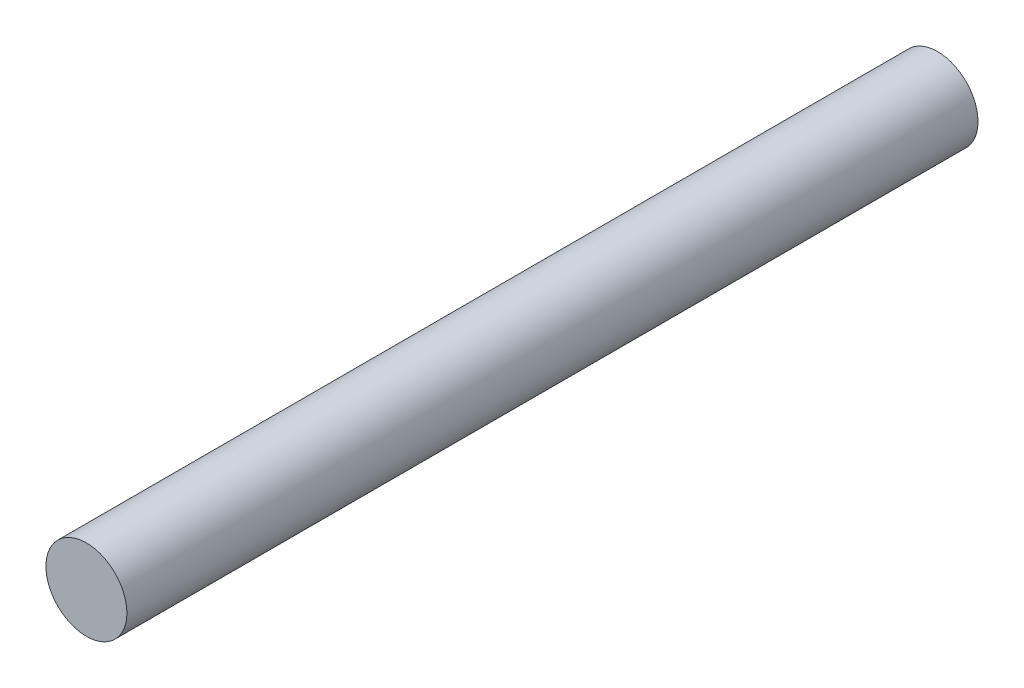
ISO-10303-21;
HEADER;
FILE_DESCRIPTION(('STEP AP214'),'2;1');
FILE_NAME('part.step','',(''),(''),'','','');
FILE_SCHEMA(('AUTOMOTIVE_DESIGN { 1 0 10303 214 1 1 1 1 }'));
ENDSEC;
DATA;
#1=APPLICATION_CONTEXT('core data for automotive mechanical design processes');
#2=APPLICATION_PROTOCOL_DEFINITION('international standard','automotive_design',2000,#1);
#3=PRODUCT_CONTEXT('',#1,'mechanical');
#4=PRODUCT('Part','Part','',(#3));
#5=PRODUCT_RELATED_PRODUCT_CATEGORY('part','',(#4));
#6=PRODUCT_DEFINITION_FORMATION('','',#4);
#7=PRODUCT_DEFINITION_CONTEXT('part definition',#1,'design');
#8=PRODUCT_DEFINITION('design','',#6,#7);
#9=PRODUCT_DEFINITION_SHAPE('','',#8);
#10=(LENGTH_UNIT() NAMED_UNIT(*) SI_UNIT(.MILLI.,.METRE.));
#11=(NAMED_UNIT(*) PLANE_ANGLE_UNIT() SI_UNIT($,.RADIAN.));
#12=(NAMED_UNIT(*) SI_UNIT($,.STERADIAN.) SOLID_ANGLE_UNIT());
#13=UNCERTAINTY_MEASURE_WITH_UNIT(LENGTH_MEASURE(1.E-05),#10,'distance_accuracy_value','');
#14=(GEOMETRIC_REPRESENTATION_CONTEXT(3) GLOBAL_UNCERTAINTY_ASSIGNED_CONTEXT((#13)) GLOBAL_UNIT_ASSIGNED_CONTEXT((#10,
#11,#12)) REPRESENTATION_CONTEXT('',''));
#15=CARTESIAN_POINT('',(0.,0.,0.));
#16=DIRECTION('',(0.,0.,1.));
#17=DIRECTION('',(1.,0.,0.));
#18=AXIS2_PLACEMENT_3D('',#15,#16,#17);
#19=CARTESIAN_POINT('',(0.,0.,20.));
#20=DIRECTION('',(0.,0.,-1.));
#21=DIRECTION('',(-1.,0.,0.));
#22=AXIS2_PLACEMENT_3D('',#19,#20,#21);
#23=CYLINDRICAL_SURFACE('',#22,1.90291704);
#24=CARTESIAN_POINT('',(0.,0.,20.));
#25=DIRECTION('',(0.,0.,1.));
#26=DIRECTION('',(1.,0.,0.));
#27=AXIS2_PLACEMENT_3D('',#24,#25,#26);
#28=CIRCLE('',#27,1.90291704);
#29=CARTESIAN_POINT('',(1.90291704,0.,20.));
#30=VERTEX_POINT('',#29);
#31=EDGE_CURVE('E10',#30,#30,#28,.T.);
#32=ORIENTED_EDGE('',*,*,#31,.F.);
#33=EDGE_LOOP('',(#32));
#34=FACE_BOUND('',#33,.T.);
#35=CARTESIAN_POINT('',(0.,0.,-20.));
#36=DIRECTION('',(0.,0.,1.));
#37=DIRECTION('',(1.,0.,0.));
#38=AXIS2_PLACEMENT_3D('',#35,#36,#37);
#39=CIRCLE('',#38,1.90291704);
#40=CARTESIAN_POINT('',(1.90291704,0.,-20.));
#41=VERTEX_POINT('',#40);
#42=EDGE_CURVE('E46',#41,#41,#39,.T.);
#43=ORIENTED_EDGE('',*,*,#42,.T.);
#44=EDGE_LOOP('',(#43));
#45=FACE_BOUND('',#44,.T.);
#46=ADVANCED_FACE('F43',(#34,#45),#23,.T.);
#47=CARTESIAN_POINT('',(0.,0.,20.));
#48=DIRECTION('',(0.,0.,1.));
#49=DIRECTION('',(1.,0.,0.));
#50=AXIS2_PLACEMENT_3D('',#47,#48,#49);
#51=PLANE('',#50);
#52=ORIENTED_EDGE('',*,*,#31,.T.);
#53=EDGE_LOOP('',(#52));
#54=FACE_BOUND('',#53,.T.);
#55=ADVANCED_FACE('F58',(#54),#51,.T.);
#56=CARTESIAN_POINT('',(0.,0.,-20.));
#57=DIRECTION('',(0.,0.,1.));
#58=DIRECTION('',(1.,0.,0.));
#59=AXIS2_PLACEMENT_3D('',#56,#57,#58);
#60=PLANE('',#59);
#61=ORIENTED_EDGE('',*,*,#42,.F.);
#62=EDGE_LOOP('',(#61));
#63=FACE_BOUND('',#62,.T.);
#64=ADVANCED_FACE('F59',(#63),#60,.F.);
#65=CLOSED_SHELL('',(#46,#55,#64));
#66=MANIFOLD_SOLID_BREP('B2',#65);
#67=ADVANCED_BREP_SHAPE_REPRESENTATION('',(#18,#66),#14);
#68=SHAPE_DEFINITION_REPRESENTATION(#9,#67);
ENDSEC;
END-ISO-10303-21;
